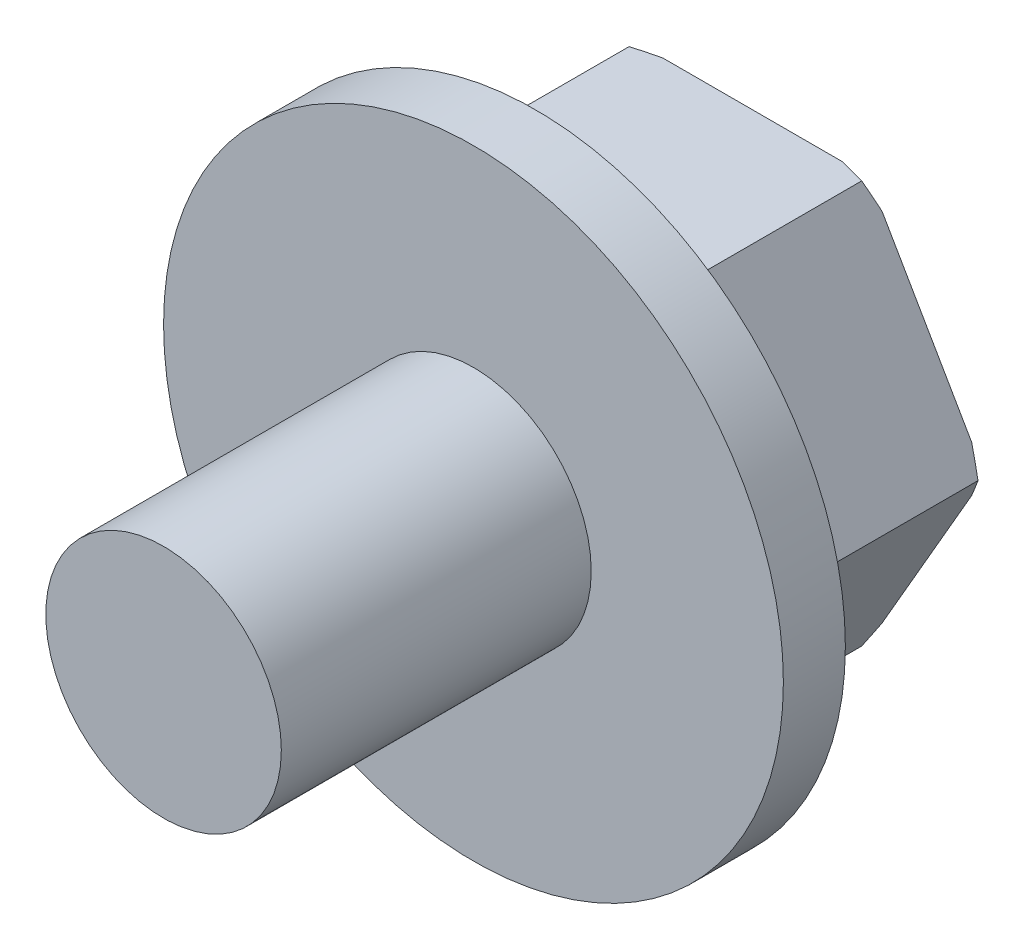
ISO-10303-21;
HEADER;
FILE_DESCRIPTION(('STEP AP214'),'2;1');
FILE_NAME('part.step','',(''),(''),'','','');
FILE_SCHEMA(('AUTOMOTIVE_DESIGN { 1 0 10303 214 1 1 1 1 }'));
ENDSEC;
DATA;
#1=APPLICATION_CONTEXT('core data for automotive mechanical design processes');
#2=APPLICATION_PROTOCOL_DEFINITION('international standard','automotive_design',2000,#1);
#3=PRODUCT_CONTEXT('',#1,'mechanical');
#4=PRODUCT('Part','Part','',(#3));
#5=PRODUCT_RELATED_PRODUCT_CATEGORY('part','',(#4));
#6=PRODUCT_DEFINITION_FORMATION('','',#4);
#7=PRODUCT_DEFINITION_CONTEXT('part definition',#1,'design');
#8=PRODUCT_DEFINITION('design','',#6,#7);
#9=PRODUCT_DEFINITION_SHAPE('','',#8);
#10=(LENGTH_UNIT() NAMED_UNIT(*) SI_UNIT(.MILLI.,.METRE.));
#11=(NAMED_UNIT(*) PLANE_ANGLE_UNIT() SI_UNIT($,.RADIAN.));
#12=(NAMED_UNIT(*) SI_UNIT($,.STERADIAN.) SOLID_ANGLE_UNIT());
#13=UNCERTAINTY_MEASURE_WITH_UNIT(LENGTH_MEASURE(1.E-05),#10,'distance_accuracy_value','');
#14=(GEOMETRIC_REPRESENTATION_CONTEXT(3) GLOBAL_UNCERTAINTY_ASSIGNED_CONTEXT((#13)) GLOBAL_UNIT_ASSIGNED_CONTEXT((#10,
#11,#12)) REPRESENTATION_CONTEXT('',''));
#15=CARTESIAN_POINT('',(0.,0.,0.));
#16=DIRECTION('',(0.,0.,1.));
#17=DIRECTION('',(1.,0.,0.));
#18=AXIS2_PLACEMENT_3D('',#15,#16,#17);
#19=CARTESIAN_POINT('',(3.75277674973256,-6.5,-9.));
#20=DIRECTION('',(0.,1.,0.));
#21=DIRECTION('',(-1.,0.,0.));
#22=AXIS2_PLACEMENT_3D('',#19,#20,#21);
#23=PLANE('',#22);
#24=CARTESIAN_POINT('',(8.28181766104751,-6.50000000000001,-7.02914133790201));
#25=CARTESIAN_POINT('',(8.04691140789701,-6.50000000000001,-7.13580066143891));
#26=CARTESIAN_POINT('',(7.81136438394347,-6.50000000000001,-7.24107552655369));
#27=CARTESIAN_POINT('',(7.33871426189048,-6.50000000000001,-7.44818481369506));
#28=CARTESIAN_POINT('',(7.10161089266545,-6.5,-7.55001861618904));
#29=CARTESIAN_POINT('',(6.62466931895793,-6.5,-7.7499498022196));
#30=CARTESIAN_POINT('',(6.38482384649444,-6.5,-7.84802991425982));
#31=CARTESIAN_POINT('',(5.90311000138813,-6.5,-8.03907689892376));
#32=CARTESIAN_POINT('',(5.66124172188347,-6.5,-8.13204400549372));
#33=CARTESIAN_POINT('',(5.17623717011095,-6.5,-8.31133703523035));
#34=CARTESIAN_POINT('',(4.9331109530856,-6.5,-8.3976900238382));
#35=CARTESIAN_POINT('',(4.4442629999642,-6.5,-8.56280360544821));
#36=CARTESIAN_POINT('',(4.19854113617215,-6.5,-8.6415638229664));
#37=CARTESIAN_POINT('',(3.70462585947118,-6.5,-8.7896928140595));
#38=CARTESIAN_POINT('',(3.4564362569125,-6.5,-8.85907419841018));
#39=CARTESIAN_POINT('',(2.95715882268171,-6.5,-8.98660717477958));
#40=CARTESIAN_POINT('',(2.70607111698214,-6.5,-9.04475925297161));
#41=CARTESIAN_POINT('',(2.27277229646997,-6.5,-9.13310647096523));
#42=CARTESIAN_POINT('',(2.09122383548099,-6.5,-9.16655299626264));
#43=CARTESIAN_POINT('',(1.72690547635735,-6.5,-9.22582503432564));
#44=CARTESIAN_POINT('',(1.54413578494297,-6.5,-9.25165180507598));
#45=CARTESIAN_POINT('',(1.17764186985032,-6.5,-9.2950114888886));
#46=CARTESIAN_POINT('',(0.993917830049214,-6.5,-9.31254594380455));
#47=CARTESIAN_POINT('',(0.625836378114421,-6.5,-9.33882033728644));
#48=CARTESIAN_POINT('',(0.441478967529576,-6.5,-9.34756029734308));
#49=CARTESIAN_POINT('',(0.0726556136066472,-6.5,-9.35597332245495));
#50=CARTESIAN_POINT('',(-0.111810216062938,-6.5,-9.35565131932693));
#51=CARTESIAN_POINT('',(-0.480500177599154,-6.5,-9.34596330712538));
#52=CARTESIAN_POINT('',(-0.664724310670014,-6.5,-9.3365973432852));
#53=CARTESIAN_POINT('',(-1.03251933626419,-6.5,-9.30910724876735));
#54=CARTESIAN_POINT('',(-1.21609021338703,-6.5,-9.29098291297134));
#55=CARTESIAN_POINT('',(-1.58224506221558,-6.5,-9.24650071901516));
#56=CARTESIAN_POINT('',(-1.76482884643231,-6.5,-9.22014134897069));
#57=CARTESIAN_POINT('',(-2.49517184775641,-6.5,-9.0991439352449));
#58=CARTESIAN_POINT('',(-3.03800602540106,-6.5,-8.97389020443029));
#59=CARTESIAN_POINT('',(-3.84218256778286,-6.5,-8.75023239462364));
#60=CARTESIAN_POINT('',(-4.10891805457427,-6.5,-8.6695828194748));
#61=CARTESIAN_POINT('',(-4.63929797297004,-6.5,-8.4986175754123));
#62=CARTESIAN_POINT('',(-4.90294262352719,-6.5,-8.40830259583661));
#63=CARTESIAN_POINT('',(-5.43049205514873,-6.5,-8.21881479537283));
#64=CARTESIAN_POINT('',(-5.6943634887476,-6.5,-8.11955035878753));
#65=CARTESIAN_POINT('',(-6.2196331143329,-6.5,-7.91464925101966));
#66=CARTESIAN_POINT('',(-6.48103114780285,-6.5,-7.80901217458146));
#67=CARTESIAN_POINT('',(-7.00004396308632,-6.5,-7.59330495095508));
#68=CARTESIAN_POINT('',(-7.25767221417062,-6.5,-7.48326703999315));
#69=CARTESIAN_POINT('',(-7.77105663645724,-6.5,-7.25907245154073));
#70=CARTESIAN_POINT('',(-8.02681325836448,-6.5,-7.14491680771469));
#71=CARTESIAN_POINT('',(-8.28181766104751,-6.5,-7.02914133790201));
#72=B_SPLINE_CURVE_WITH_KNOTS('',3,(#24,#25,#26,#27,#28,#29,#30,#31,#32,#33,#34,#35,#36,#37,#38,
#39,#40,#41,#42,#43,#44,#45,#46,#47,#48,#49,#50,#51,#52,#53,#54,#55,#56,#57,#58,#59,#60,#61,#62,
#63,#64,#65,#66,#67,#68,#69,#70,#71),.UNSPECIFIED.,.F.,.F.,(4,2,2,2,2,2,2,2,2,2,2,2,2,2,2,2,2,2,
2,2,2,2,2,4),(0.,0.773972261519475,1.54808313532294,2.32540851640581,3.10269830122373,
3.87661547485808,4.65057090127108,5.42347509030744,6.19634580891712,6.75001639438073,
7.30359552028251,7.85707167447617,8.41054647616225,8.96372006458749,9.51689088632987,
10.0700746637876,10.6233600609622,12.290652469806,13.1265747792743,13.9624375103302,
14.8081222705279,15.6538608672108,16.4942544222457,17.3344384637358),.UNSPECIFIED.);
#73=CARTESIAN_POINT('',(3.75277674973256,-6.5,-8.77414395477849));
#74=VERTEX_POINT('',#73);
#75=CARTESIAN_POINT('',(2.89207693830289,-6.5,-9.));
#76=VERTEX_POINT('',#75);
#77=EDGE_CURVE('E246',#74,#76,#72,.T.);
#78=ORIENTED_EDGE('',*,*,#77,.F.);
#79=DIRECTION('',(0.,0.,1.));
#80=VECTOR('',#79,1.);
#81=CARTESIAN_POINT('',(3.75277674973256,-6.5,-9.));
#82=LINE('',#81,#80);
#83=CARTESIAN_POINT('',(3.75277674973256,-6.5,-2.));
#84=VERTEX_POINT('',#83);
#85=EDGE_CURVE('E164',#74,#84,#82,.T.);
#86=ORIENTED_EDGE('',*,*,#85,.T.);
#87=DIRECTION('',(-1.,0.,0.));
#88=VECTOR('',#87,1.);
#89=CARTESIAN_POINT('',(3.75277674973256,-6.5,-2.));
#90=LINE('',#89,#88);
#91=CARTESIAN_POINT('',(-3.75277674973257,-6.5,-2.));
#92=VERTEX_POINT('',#91);
#93=EDGE_CURVE('E165',#84,#92,#90,.T.);
#94=ORIENTED_EDGE('',*,*,#93,.T.);
#95=DIRECTION('',(0.,0.,1.));
#96=VECTOR('',#95,1.);
#97=CARTESIAN_POINT('',(-3.75277674973257,-6.5,-9.));
#98=LINE('',#97,#96);
#99=CARTESIAN_POINT('',(-3.75277674973247,-6.50000000000017,-8.77414395477862));
#100=VERTEX_POINT('',#99);
#101=EDGE_CURVE('E190',#100,#92,#98,.T.);
#102=ORIENTED_EDGE('',*,*,#101,.F.);
#103=CARTESIAN_POINT('',(-2.8920769383029,-6.5,-9.));
#104=VERTEX_POINT('',#103);
#105=EDGE_CURVE('E238',#104,#100,#72,.T.);
#106=ORIENTED_EDGE('',*,*,#105,.F.);
#107=DIRECTION('',(-1.,0.,0.));
#108=VECTOR('',#107,1.);
#109=CARTESIAN_POINT('',(3.75277674973256,-6.5,-9.));
#110=LINE('',#109,#108);
#111=EDGE_CURVE('E148',#76,#104,#110,.T.);
#112=ORIENTED_EDGE('',*,*,#111,.F.);
#113=EDGE_LOOP('',(#78,#86,#94,#102,#106,#112));
#114=FACE_BOUND('',#113,.T.);
#115=ADVANCED_FACE('F34',(#114),#23,.F.);
#116=CARTESIAN_POINT('',(-3.75277674973257,-6.5,-9.));
#117=DIRECTION('',(0.866025403784438,0.5,0.));
#118=DIRECTION('',(-0.5,0.866025403784439,0.));
#119=AXIS2_PLACEMENT_3D('',#116,#117,#118);
#120=PLANE('',#119);
#121=CARTESIAN_POINT('',(-1.13793376041405,-11.0290409113149,-6.70605461637835));
#122=CARTESIAN_POINT('',(-1.25589780943969,-10.824721184936,-6.81638215702514));
#123=CARTESIAN_POINT('',(-1.37414325918223,-10.6199140582181,-6.92552455235033));
#124=CARTESIAN_POINT('',(-1.61131562440023,-10.2091194715092,-7.14088275188807));
#125=CARTESIAN_POINT('',(-1.73024262284655,-10.0031318678085,-7.24709819022398));
#126=CARTESIAN_POINT('',(-1.96924786629488,-9.58916264288066,-7.45635150098988));
#127=CARTESIAN_POINT('',(-2.0893285729588,-9.38117675792997,-7.5593781620316));
#128=CARTESIAN_POINT('',(-2.33038715653231,-8.96365104358007,-7.76113449493463));
#129=CARTESIAN_POINT('',(-2.45136500499501,-8.7541112634523,-7.85986430236598));
#130=CARTESIAN_POINT('',(-2.69748005604583,-8.32782749052487,-8.05455281144288));
#131=CARTESIAN_POINT('',(-2.82264431496034,-8.11103663479324,-8.15037533590913));
#132=CARTESIAN_POINT('',(-3.07423310053659,-7.67527207556061,-8.33523006799508));
#133=CARTESIAN_POINT('',(-3.2006576882921,-7.45629826624213,-8.42426194461428));
#134=CARTESIAN_POINT('',(-3.45479814739088,-7.01611407882416,-8.59384876365764));
#135=CARTESIAN_POINT('',(-3.58251265317564,-6.7949060659414,-8.67441181282673));
#136=CARTESIAN_POINT('',(-3.83944110035023,-6.34989294152523,-8.82520879634314));
#137=CARTESIAN_POINT('',(-3.96865484666894,-6.12608816786492,-8.89544405856735));
#138=CARTESIAN_POINT('',(-4.27753849391411,-5.5910859972091,-9.04738500187079));
#139=CARTESIAN_POINT('',(-4.45792690450027,-5.27864410497727,-9.12348701178583));
#140=CARTESIAN_POINT('',(-4.73036846575257,-4.8067614787949,-9.21512990599749));
#141=CARTESIAN_POINT('',(-4.82149064678282,-4.64893323155403,-9.24192559788983));
#142=CARTESIAN_POINT('',(-5.00423892971958,-4.33240392051158,-9.28734144150385));
#143=CARTESIAN_POINT('',(-5.09586496232345,-4.17370297674571,-9.30596269044761));
#144=CARTESIAN_POINT('',(-5.27839093782205,-3.85755871348107,-9.33433358048475));
#145=CARTESIAN_POINT('',(-5.36928695417243,-3.70012219495661,-9.34418374695059));
#146=CARTESIAN_POINT('',(-5.55121126899005,-3.38502003856032,-9.35508674173192));
#147=CARTESIAN_POINT('',(-5.6422395660073,-3.22735440319999,-9.35613966576239));
#148=CARTESIAN_POINT('',(-5.82421329045264,-2.91216666681812,-9.34941502148687));
#149=CARTESIAN_POINT('',(-5.91515871871977,-2.75464456434333,-9.34163754360558));
#150=CARTESIAN_POINT('',(-6.09677314868232,-2.44007914426053,-9.31748790120624));
#151=CARTESIAN_POINT('',(-6.18744210629905,-2.28303590299905,-9.30111443158763));
#152=CARTESIAN_POINT('',(-6.40123985937311,-1.91272733213072,-9.25278713694611));
#153=CARTESIAN_POINT('',(-6.52417229998942,-1.69980209908482,-9.21733164970232));
#154=CARTESIAN_POINT('',(-6.76887034621695,-1.2759726505059,-9.13292928698612));
#155=CARTESIAN_POINT('',(-6.89063578123641,-1.06506873044647,-9.08398046928281));
#156=CARTESIAN_POINT('',(-7.13298101570221,-0.645314471379513,-8.97443810530169));
#157=CARTESIAN_POINT('',(-7.25355932018932,-0.436466721717338,-8.91383146528296));
#158=CARTESIAN_POINT('',(-7.49336630984826,-0.0211088316179082,-8.78288403378761));
#159=CARTESIAN_POINT('',(-7.61259507934844,0.185401454880324,-8.71254385420363));
#160=CARTESIAN_POINT('',(-7.85120784718117,0.598690892101246,-8.56291044047199));
#161=CARTESIAN_POINT('',(-7.97057644167009,0.805443362584153,-8.48351963703173));
#162=CARTESIAN_POINT('',(-8.20804860063798,1.2167572072996,-8.31801892116));
#163=CARTESIAN_POINT('',(-8.32615294403785,1.42131993066273,-8.23191345327483));
#164=CARTESIAN_POINT('',(-8.56128385492858,1.82857861475543,-8.0541713955546));
#165=CARTESIAN_POINT('',(-8.6783106400695,2.03127495246596,-7.96253595224728));
#166=CARTESIAN_POINT('',(-8.91144434592434,2.43507437596336,-7.77470009383696));
#167=CARTESIAN_POINT('',(-9.02755124939309,2.63617743188072,-7.67849959338732));
#168=CARTESIAN_POINT('',(-9.22584446233544,2.97963135149295,-7.51039911380142));
#169=CARTESIAN_POINT('',(-9.30822776861516,3.12232342366494,-7.43942482172704));
#170=CARTESIAN_POINT('',(-9.47262267245291,3.40706374961732,-7.29579049864082));
#171=CARTESIAN_POINT('',(-9.55463428278451,3.54911202552219,-7.22313052609169));
#172=CARTESIAN_POINT('',(-9.71743666185269,3.83109401766136,-7.07712502346139));
#173=CARTESIAN_POINT('',(-9.7982310218556,3.97103395415142,-7.00379548641795));
#174=CARTESIAN_POINT('',(-9.95952640583916,4.25040575423728,-6.85584917258802));
#175=CARTESIAN_POINT('',(-10.0400274246483,4.38983760887573,-6.78123237323911));
#176=CARTESIAN_POINT('',(-10.1203964887836,4.52904091131495,-6.70605461637836));
#177=B_SPLINE_CURVE_WITH_KNOTS('',3,(#121,#122,#123,#124,#125,#126,#127,#128,#129,#130,#131,
#132,#133,#134,#135,#136,#137,#138,#139,#140,#141,#142,#143,#144,#145,#146,#147,#148,#149,#150,
#151,#152,#153,#154,#155,#156,#157,#158,#159,#160,#161,#162,#163,#164,#165,#166,#167,#168,#169,
#170,#171,#172,#173,#174,#175,#176),.UNSPECIFIED.,.F.,.F.,(4,2,2,2,2,2,2,2,2,2,2,2,2,2,2,2,2,2,
2,2,2,2,2,2,2,2,2,4),(0.,0.781358476670392,1.56281418599703,2.34676154185768,3.13068414543711,
3.9347285419179,4.73881210538882,5.54211881694601,6.34532215428836,7.45027665348182,
8.00273593510876,8.55512103969295,9.10109059666072,9.64705421341148,10.1930122394593,
10.7390531804626,11.4838279807437,12.2287100399877,12.9744336674474,13.7201104367556,
14.4747621900239,15.2289185990882,15.9829191828207,16.7369338686289,17.2751331082826,
17.8133137099522,18.3456548082797,18.8780052466816),.UNSPECIFIED.);
#178=CARTESIAN_POINT('',(-4.1831266554474,-5.75461209826943,-9.));
#179=VERTEX_POINT('',#178);
#180=EDGE_CURVE('E142',#100,#179,#177,.T.);
#181=ORIENTED_EDGE('',*,*,#180,.F.);
#182=ORIENTED_EDGE('',*,*,#101,.T.);
#183=DIRECTION('',(-0.5,0.866025403784439,0.));
#184=VECTOR('',#183,1.);
#185=CARTESIAN_POINT('',(-3.75277674973257,-6.5,-2.));
#186=LINE('',#185,#184);
#187=CARTESIAN_POINT('',(-7.50555349946513,0.,-2.));
#188=VERTEX_POINT('',#187);
#189=EDGE_CURVE('E168',#92,#188,#186,.T.);
#190=ORIENTED_EDGE('',*,*,#189,.T.);
#191=DIRECTION('',(0.,0.,1.));
#192=VECTOR('',#191,1.);
#193=CARTESIAN_POINT('',(-7.50555349946513,0.,-9.));
#194=LINE('',#193,#192);
#195=CARTESIAN_POINT('',(-7.50555349946523,-1.74071033628086E-13,-8.77414395477862));
#196=VERTEX_POINT('',#195);
#197=EDGE_CURVE('E141',#196,#188,#194,.T.);
#198=ORIENTED_EDGE('',*,*,#197,.F.);
#199=CARTESIAN_POINT('',(-7.0752035937503,-0.74538790173057,-9.));
#200=VERTEX_POINT('',#199);
#201=EDGE_CURVE('E125',#200,#196,#177,.T.);
#202=ORIENTED_EDGE('',*,*,#201,.F.);
#203=DIRECTION('',(-0.5,0.866025403784439,0.));
#204=VECTOR('',#203,1.);
#205=CARTESIAN_POINT('',(-3.75277674973257,-6.5,-9.));
#206=LINE('',#205,#204);
#207=EDGE_CURVE('E139',#179,#200,#206,.T.);
#208=ORIENTED_EDGE('',*,*,#207,.F.);
#209=EDGE_LOOP('',(#181,#182,#190,#198,#202,#208));
#210=FACE_BOUND('',#209,.T.);
#211=ADVANCED_FACE('F138',(#210),#120,.F.);
#212=CARTESIAN_POINT('',(-7.50555349946513,0.,-9.));
#213=DIRECTION('',(0.866025403784438,-0.5,0.));
#214=DIRECTION('',(0.5,0.866025403784438,0.));
#215=AXIS2_PLACEMENT_3D('',#212,#213,#214);
#216=PLANE('',#215);
#217=CARTESIAN_POINT('',(-10.1203964887837,-4.52904091131495,-6.70605461637835));
#218=CARTESIAN_POINT('',(-10.002432439758,-4.32472118493601,-6.81638215702514));
#219=CARTESIAN_POINT('',(-9.88418699001547,-4.11991405821809,-6.92552455235033));
#220=CARTESIAN_POINT('',(-9.64701462479747,-3.70911947150924,-7.14088275188807));
#221=CARTESIAN_POINT('',(-9.52808762635116,-3.50313186780854,-7.24709819022398));
#222=CARTESIAN_POINT('',(-9.28908238290282,-3.08916264288067,-7.45635150098988));
#223=CARTESIAN_POINT('',(-9.1690016762389,-2.88117675792998,-7.55937816203159));
#224=CARTESIAN_POINT('',(-8.92794309266539,-2.46365104358008,-7.76113449493463));
#225=CARTESIAN_POINT('',(-8.80696524420269,-2.2541112634523,-7.85986430236598));
#226=CARTESIAN_POINT('',(-8.56085019315187,-1.82782749052488,-8.05455281144287));
#227=CARTESIAN_POINT('',(-8.43568593423736,-1.61103663479325,-8.15037533590913));
#228=CARTESIAN_POINT('',(-8.18409714866111,-1.17527207556062,-8.33523006799508));
#229=CARTESIAN_POINT('',(-8.0576725609056,-0.956298266242135,-8.42426194461428));
#230=CARTESIAN_POINT('',(-7.80353210180682,-0.516114078824168,-8.59384876365764));
#231=CARTESIAN_POINT('',(-7.67581759602206,-0.294906065941407,-8.67441181282673));
#232=CARTESIAN_POINT('',(-7.41888914884747,0.150107058474761,-8.82520879634314));
#233=CARTESIAN_POINT('',(-7.28967540252876,0.37391183213508,-8.89544405856735));
#234=CARTESIAN_POINT('',(-6.98079175528359,0.908914002790892,-9.04738500187079));
#235=CARTESIAN_POINT('',(-6.80040334469743,1.22135589502272,-9.12348701178583));
#236=CARTESIAN_POINT('',(-6.52796178344513,1.69323852120509,-9.21512990599749));
#237=CARTESIAN_POINT('',(-6.43683960241488,1.85106676844596,-9.24192559788983));
#238=CARTESIAN_POINT('',(-6.25409131947812,2.16759607948842,-9.28734144150385));
#239=CARTESIAN_POINT('',(-6.16246528687425,2.32629702325428,-9.30596269044761));
#240=CARTESIAN_POINT('',(-5.97993931137565,2.64244128651892,-9.33433358048475));
#241=CARTESIAN_POINT('',(-5.88904329502528,2.79987780504338,-9.34418374695059));
#242=CARTESIAN_POINT('',(-5.70711898020765,3.11497996143967,-9.35508674173192));
#243=CARTESIAN_POINT('',(-5.6160906831904,3.27264559680001,-9.35613966576239));
#244=CARTESIAN_POINT('',(-5.43411695874507,3.58783333318187,-9.34941502148687));
#245=CARTESIAN_POINT('',(-5.34317153047793,3.74535543565666,-9.34163754360558));
#246=CARTESIAN_POINT('',(-5.16155710051538,4.05992085573946,-9.31748790120624));
#247=CARTESIAN_POINT('',(-5.07088814289865,4.21696409700094,-9.30111443158764));
#248=CARTESIAN_POINT('',(-4.85709038982459,4.58727266786928,-9.25278713694611));
#249=CARTESIAN_POINT('',(-4.73415794920828,4.80019790091517,-9.21733164970232));
#250=CARTESIAN_POINT('',(-4.48945990298075,5.22402734949409,-9.13292928698613));
#251=CARTESIAN_POINT('',(-4.36769446796129,5.43493126955352,-9.08398046928282));
#252=CARTESIAN_POINT('',(-4.12534923349549,5.85468552862048,-8.9744381053017));
#253=CARTESIAN_POINT('',(-4.00477092900839,6.06353327828265,-8.91383146528296));
#254=CARTESIAN_POINT('',(-3.76496393934945,6.47889116838208,-8.78288403378761));
#255=CARTESIAN_POINT('',(-3.64573516984927,6.68540145488031,-8.71254385420364));
#256=CARTESIAN_POINT('',(-3.40712240201654,7.09869089210124,-8.56291044047199));
#257=CARTESIAN_POINT('',(-3.28775380752761,7.30544336258414,-8.48351963703174));
#258=CARTESIAN_POINT('',(-3.05028164855973,7.71675720729959,-8.31801892116001));
#259=CARTESIAN_POINT('',(-2.93217730515986,7.92131993066272,-8.23191345327484));
#260=CARTESIAN_POINT('',(-2.69704639426913,8.32857861475542,-8.0541713955546));
#261=CARTESIAN_POINT('',(-2.5800196091282,8.53127495246595,-7.96253595224729));
#262=CARTESIAN_POINT('',(-2.34688590327336,8.93507437596334,-7.77470009383696));
#263=CARTESIAN_POINT('',(-2.23077899980462,9.13617743188071,-7.67849959338732));
#264=CARTESIAN_POINT('',(-2.03248578686226,9.47963135149294,-7.51039911380143));
#265=CARTESIAN_POINT('',(-1.95010248058254,9.62232342366493,-7.43942482172704));
#266=CARTESIAN_POINT('',(-1.78570757674479,9.90706374961731,-7.29579049864082));
#267=CARTESIAN_POINT('',(-1.70369596641319,10.0491120255222,-7.2231305260917));
#268=CARTESIAN_POINT('',(-1.54089358734501,10.3310940176614,-7.07712502346139));
#269=CARTESIAN_POINT('',(-1.4600992273421,10.4710339541514,-7.00379548641795));
#270=CARTESIAN_POINT('',(-1.29880384335853,10.7504057542373,-6.85584917258802));
#271=CARTESIAN_POINT('',(-1.21830282454941,10.8898376088757,-6.78123237323911));
#272=CARTESIAN_POINT('',(-1.13793376041404,11.029040911315,-6.70605461637836));
#273=B_SPLINE_CURVE_WITH_KNOTS('',3,(#217,#218,#219,#220,#221,#222,#223,#224,#225,#226,#227,
#228,#229,#230,#231,#232,#233,#234,#235,#236,#237,#238,#239,#240,#241,#242,#243,#244,#245,#246,
#247,#248,#249,#250,#251,#252,#253,#254,#255,#256,#257,#258,#259,#260,#261,#262,#263,#264,#265,
#266,#267,#268,#269,#270,#271,#272),.UNSPECIFIED.,.F.,.F.,(4,2,2,2,2,2,2,2,2,2,2,2,2,2,2,2,2,2,
2,2,2,2,2,2,2,2,2,4),(0.,0.781358476670394,1.56281418599703,2.34676154185768,3.13068414543711,
3.9347285419179,4.73881210538882,5.54211881694601,6.34532215428836,7.45027665348183,
8.00273593510877,8.55512103969295,9.10109059666072,9.64705421341148,10.1930122394593,
10.7390531804626,11.4838279807437,12.2287100399877,12.9744336674474,13.7201104367556,
14.4747621900239,15.2289185990882,15.9829191828207,16.7369338686289,17.2751331082826,
17.8133137099522,18.3456548082798,18.8780052466817),.UNSPECIFIED.);
#274=CARTESIAN_POINT('',(-7.0752035937503,0.745387901730564,-9.));
#275=VERTEX_POINT('',#274);
#276=EDGE_CURVE('E127',#196,#275,#273,.T.);
#277=ORIENTED_EDGE('',*,*,#276,.F.);
#278=ORIENTED_EDGE('',*,*,#197,.T.);
#279=DIRECTION('',(0.5,0.866025403784438,0.));
#280=VECTOR('',#279,1.);
#281=CARTESIAN_POINT('',(-7.50555349946513,0.,-2.));
#282=LINE('',#281,#280);
#283=CARTESIAN_POINT('',(-3.75277674973256,6.5,-2.));
#284=VERTEX_POINT('',#283);
#285=EDGE_CURVE('E171',#188,#284,#282,.T.);
#286=ORIENTED_EDGE('',*,*,#285,.T.);
#287=DIRECTION('',(0.,0.,1.));
#288=VECTOR('',#287,1.);
#289=CARTESIAN_POINT('',(-3.75277674973256,6.5,-9.));
#290=LINE('',#289,#288);
#291=CARTESIAN_POINT('',(-3.75277674973256,6.5,-8.77414395477849));
#292=VERTEX_POINT('',#291);
#293=EDGE_CURVE('E187',#292,#284,#290,.T.);
#294=ORIENTED_EDGE('',*,*,#293,.F.);
#295=CARTESIAN_POINT('',(-4.18312665544739,5.75461209826944,-9.));
#296=VERTEX_POINT('',#295);
#297=EDGE_CURVE('E307',#296,#292,#273,.T.);
#298=ORIENTED_EDGE('',*,*,#297,.F.);
#299=DIRECTION('',(0.5,0.866025403784438,0.));
#300=VECTOR('',#299,1.);
#301=CARTESIAN_POINT('',(-7.50555349946513,0.,-9.));
#302=LINE('',#301,#300);
#303=EDGE_CURVE('E147',#275,#296,#302,.T.);
#304=ORIENTED_EDGE('',*,*,#303,.F.);
#305=EDGE_LOOP('',(#277,#278,#286,#294,#298,#304));
#306=FACE_BOUND('',#305,.T.);
#307=ADVANCED_FACE('F231',(#306),#216,.F.);
#308=CARTESIAN_POINT('',(-3.75277674973256,6.5,-9.));
#309=DIRECTION('',(0.,-1.,0.));
#310=DIRECTION('',(1.,0.,0.));
#311=AXIS2_PLACEMENT_3D('',#308,#309,#310);
#312=PLANE('',#311);
#313=CARTESIAN_POINT('',(-8.2818176610475,6.5,-7.02914133790201));
#314=CARTESIAN_POINT('',(-8.04691140789701,6.5,-7.13580066143891));
#315=CARTESIAN_POINT('',(-7.81136438394346,6.5,-7.24107552655369));
#316=CARTESIAN_POINT('',(-7.33871426189048,6.5,-7.44818481369506));
#317=CARTESIAN_POINT('',(-7.10161089266545,6.5,-7.55001861618904));
#318=CARTESIAN_POINT('',(-6.62466931895792,6.5,-7.7499498022196));
#319=CARTESIAN_POINT('',(-6.38482384649444,6.5,-7.84802991425982));
#320=CARTESIAN_POINT('',(-5.90311000138813,6.5,-8.03907689892376));
#321=CARTESIAN_POINT('',(-5.66124172188347,6.5,-8.13204400549372));
#322=CARTESIAN_POINT('',(-5.17623717011095,6.5,-8.31133703523036));
#323=CARTESIAN_POINT('',(-4.93311095308559,6.5,-8.3976900238382));
#324=CARTESIAN_POINT('',(-4.44426299996419,6.5,-8.56280360544821));
#325=CARTESIAN_POINT('',(-4.19854113617215,6.5,-8.6415638229664));
#326=CARTESIAN_POINT('',(-3.70462585947118,6.5,-8.78969281405951));
#327=CARTESIAN_POINT('',(-3.4564362569125,6.5,-8.85907419841018));
#328=CARTESIAN_POINT('',(-2.95715882268171,6.5,-8.98660717477959));
#329=CARTESIAN_POINT('',(-2.70607111698214,6.5,-9.04475925297161));
#330=CARTESIAN_POINT('',(-2.27277229646996,6.5,-9.13310647096523));
#331=CARTESIAN_POINT('',(-2.09122383548098,6.5,-9.16655299626265));
#332=CARTESIAN_POINT('',(-1.72690547635735,6.5,-9.22582503432564));
#333=CARTESIAN_POINT('',(-1.54413578494297,6.5,-9.25165180507598));
#334=CARTESIAN_POINT('',(-1.17764186985032,6.5,-9.2950114888886));
#335=CARTESIAN_POINT('',(-0.993917830049212,6.5,-9.31254594380455));
#336=CARTESIAN_POINT('',(-0.625836378114419,6.5,-9.33882033728644));
#337=CARTESIAN_POINT('',(-0.441478967529574,6.5,-9.34756029734308));
#338=CARTESIAN_POINT('',(-0.072655613606644,6.5,-9.35597332245495));
#339=CARTESIAN_POINT('',(0.111810216062941,6.5,-9.35565131932693));
#340=CARTESIAN_POINT('',(0.480500177599156,6.5,-9.34596330712538));
#341=CARTESIAN_POINT('',(0.664724310670016,6.5,-9.3365973432852));
#342=CARTESIAN_POINT('',(1.0325193362642,6.5,-9.30910724876735));
#343=CARTESIAN_POINT('',(1.21609021338703,6.5,-9.29098291297134));
#344=CARTESIAN_POINT('',(1.58224506221558,6.5,-9.24650071901517));
#345=CARTESIAN_POINT('',(1.76482884643231,6.5,-9.22014134897069));
#346=CARTESIAN_POINT('',(2.49517184775641,6.5,-9.0991439352449));
#347=CARTESIAN_POINT('',(3.03800602540106,6.5,-8.97389020443029));
#348=CARTESIAN_POINT('',(3.84218256778287,6.5,-8.75023239462364));
#349=CARTESIAN_POINT('',(4.10891805457427,6.5,-8.6695828194748));
#350=CARTESIAN_POINT('',(4.63929797297004,6.5,-8.4986175754123));
#351=CARTESIAN_POINT('',(4.9029426235272,6.5,-8.40830259583661));
#352=CARTESIAN_POINT('',(5.43049205514873,6.5,-8.21881479537283));
#353=CARTESIAN_POINT('',(5.6943634887476,6.5,-8.11955035878753));
#354=CARTESIAN_POINT('',(6.2196331143329,6.5,-7.91464925101966));
#355=CARTESIAN_POINT('',(6.48103114780285,6.5,-7.80901217458146));
#356=CARTESIAN_POINT('',(7.00004396308632,6.5,-7.59330495095509));
#357=CARTESIAN_POINT('',(7.25767221417061,6.5,-7.48326703999315));
#358=CARTESIAN_POINT('',(7.77105663645724,6.5,-7.25907245154073));
#359=CARTESIAN_POINT('',(8.02681325836448,6.5,-7.14491680771469));
#360=CARTESIAN_POINT('',(8.28181766104751,6.5,-7.02914133790201));
#361=B_SPLINE_CURVE_WITH_KNOTS('',3,(#313,#314,#315,#316,#317,#318,#319,#320,#321,#322,#323,
#324,#325,#326,#327,#328,#329,#330,#331,#332,#333,#334,#335,#336,#337,#338,#339,#340,#341,#342,
#343,#344,#345,#346,#347,#348,#349,#350,#351,#352,#353,#354,#355,#356,#357,#358,#359,#360),
.UNSPECIFIED.,.F.,.F.,(4,2,2,2,2,2,2,2,2,2,2,2,2,2,2,2,2,2,2,2,2,2,2,4),(0.,0.773972261519474,
1.54808313532294,2.32540851640581,3.10269830122373,3.87661547485808,4.65057090127108,
5.42347509030744,6.19634580891712,6.75001639438074,7.30359552028251,7.85707167447617,
8.41054647616225,8.96372006458749,9.51689088632987,10.0700746637876,10.6233600609622,
12.290652469806,13.1265747792743,13.9624375103302,14.8081222705279,15.6538608672108,
16.4942544222457,17.3344384637358),.UNSPECIFIED.);
#362=CARTESIAN_POINT('',(-2.89207693830289,6.5,-9.));
#363=VERTEX_POINT('',#362);
#364=EDGE_CURVE('E309',#292,#363,#361,.T.);
#365=ORIENTED_EDGE('',*,*,#364,.F.);
#366=ORIENTED_EDGE('',*,*,#293,.T.);
#367=DIRECTION('',(1.,0.,0.));
#368=VECTOR('',#367,1.);
#369=CARTESIAN_POINT('',(-3.75277674973256,6.5,-2.));
#370=LINE('',#369,#368);
#371=CARTESIAN_POINT('',(3.75277674973257,6.5,-2.));
#372=VERTEX_POINT('',#371);
#373=EDGE_CURVE('E174',#284,#372,#370,.T.);
#374=ORIENTED_EDGE('',*,*,#373,.T.);
#375=DIRECTION('',(0.,0.,1.));
#376=VECTOR('',#375,1.);
#377=CARTESIAN_POINT('',(3.75277674973257,6.5,-9.));
#378=LINE('',#377,#376);
#379=CARTESIAN_POINT('',(3.75277674973247,6.50000000000017,-8.77414395477862));
#380=VERTEX_POINT('',#379);
#381=EDGE_CURVE('E185',#380,#372,#378,.T.);
#382=ORIENTED_EDGE('',*,*,#381,.F.);
#383=CARTESIAN_POINT('',(2.8920769383029,6.5,-9.));
#384=VERTEX_POINT('',#383);
#385=EDGE_CURVE('E282',#384,#380,#361,.T.);
#386=ORIENTED_EDGE('',*,*,#385,.F.);
#387=DIRECTION('',(1.,0.,0.));
#388=VECTOR('',#387,1.);
#389=CARTESIAN_POINT('',(-3.75277674973256,6.5,-9.));
#390=LINE('',#389,#388);
#391=EDGE_CURVE('E150',#363,#384,#390,.T.);
#392=ORIENTED_EDGE('',*,*,#391,.F.);
#393=EDGE_LOOP('',(#365,#366,#374,#382,#386,#392));
#394=FACE_BOUND('',#393,.T.);
#395=ADVANCED_FACE('F293',(#394),#312,.F.);
#396=CARTESIAN_POINT('',(3.75277674973257,6.5,-9.));
#397=DIRECTION('',(-0.866025403784439,-0.5,0.));
#398=DIRECTION('',(0.5,-0.866025403784439,0.));
#399=AXIS2_PLACEMENT_3D('',#396,#397,#398);
#400=PLANE('',#399);
#401=CARTESIAN_POINT('',(1.13793376041405,11.0290409113149,-6.70605461637835));
#402=CARTESIAN_POINT('',(1.25589780943969,10.824721184936,-6.81638215702514));
#403=CARTESIAN_POINT('',(1.37414325918223,10.6199140582181,-6.92552455235033));
#404=CARTESIAN_POINT('',(1.61131562440023,10.2091194715092,-7.14088275188807));
#405=CARTESIAN_POINT('',(1.73024262284655,10.0031318678085,-7.24709819022398));
#406=CARTESIAN_POINT('',(1.96924786629488,9.58916264288066,-7.45635150098988));
#407=CARTESIAN_POINT('',(2.0893285729588,9.38117675792998,-7.5593781620316));
#408=CARTESIAN_POINT('',(2.33038715653231,8.96365104358008,-7.76113449493463));
#409=CARTESIAN_POINT('',(2.45136500499501,8.7541112634523,-7.85986430236598));
#410=CARTESIAN_POINT('',(2.69748005604583,8.32782749052487,-8.05455281144288));
#411=CARTESIAN_POINT('',(2.82264431496034,8.11103663479324,-8.15037533590913));
#412=CARTESIAN_POINT('',(3.0742331005366,7.67527207556062,-8.33523006799508));
#413=CARTESIAN_POINT('',(3.2006576882921,7.45629826624213,-8.42426194461428));
#414=CARTESIAN_POINT('',(3.45479814739088,7.01611407882416,-8.59384876365764));
#415=CARTESIAN_POINT('',(3.58251265317565,6.7949060659414,-8.67441181282673));
#416=CARTESIAN_POINT('',(3.83944110035024,6.34989294152524,-8.82520879634314));
#417=CARTESIAN_POINT('',(3.96865484666894,6.12608816786492,-8.89544405856734));
#418=CARTESIAN_POINT('',(4.27753849391411,5.5910859972091,-9.04738500187079));
#419=CARTESIAN_POINT('',(4.45792690450028,5.27864410497727,-9.12348701178583));
#420=CARTESIAN_POINT('',(4.73036846575257,4.8067614787949,-9.21512990599749));
#421=CARTESIAN_POINT('',(4.82149064678282,4.64893323155403,-9.24192559788983));
#422=CARTESIAN_POINT('',(5.00423892971959,4.33240392051158,-9.28734144150385));
#423=CARTESIAN_POINT('',(5.09586496232346,4.17370297674571,-9.30596269044761));
#424=CARTESIAN_POINT('',(5.27839093782205,3.85755871348107,-9.33433358048475));
#425=CARTESIAN_POINT('',(5.36928695417243,3.70012219495661,-9.34418374695059));
#426=CARTESIAN_POINT('',(5.55121126899005,3.38502003856033,-9.35508674173192));
#427=CARTESIAN_POINT('',(5.6422395660073,3.22735440319999,-9.35613966576239));
#428=CARTESIAN_POINT('',(5.82421329045264,2.91216666681812,-9.34941502148687));
#429=CARTESIAN_POINT('',(5.91515871871978,2.75464456434333,-9.34163754360558));
#430=CARTESIAN_POINT('',(6.09677314868233,2.44007914426053,-9.31748790120624));
#431=CARTESIAN_POINT('',(6.18744210629905,2.28303590299906,-9.30111443158763));
#432=CARTESIAN_POINT('',(6.40123985937311,1.91272733213072,-9.25278713694611));
#433=CARTESIAN_POINT('',(6.52417229998942,1.69980209908482,-9.21733164970232));
#434=CARTESIAN_POINT('',(6.76887034621695,1.2759726505059,-9.13292928698612));
#435=CARTESIAN_POINT('',(6.89063578123641,1.06506873044647,-9.08398046928281));
#436=CARTESIAN_POINT('',(7.13298101570221,0.645314471379516,-8.97443810530169));
#437=CARTESIAN_POINT('',(7.25355932018932,0.436466721717341,-8.91383146528296));
#438=CARTESIAN_POINT('',(7.49336630984826,0.0211088316179116,-8.78288403378761));
#439=CARTESIAN_POINT('',(7.61259507934844,-0.185401454880321,-8.71254385420363));
#440=CARTESIAN_POINT('',(7.85120784718117,-0.598690892101244,-8.56291044047199));
#441=CARTESIAN_POINT('',(7.97057644167009,-0.805443362584151,-8.48351963703173));
#442=CARTESIAN_POINT('',(8.20804860063798,-1.2167572072996,-8.31801892116));
#443=CARTESIAN_POINT('',(8.32615294403785,-1.42131993066273,-8.23191345327483));
#444=CARTESIAN_POINT('',(8.56128385492858,-1.82857861475543,-8.0541713955546));
#445=CARTESIAN_POINT('',(8.6783106400695,-2.03127495246596,-7.96253595224728));
#446=CARTESIAN_POINT('',(8.91144434592434,-2.43507437596336,-7.77470009383696));
#447=CARTESIAN_POINT('',(9.02755124939309,-2.63617743188072,-7.67849959338732));
#448=CARTESIAN_POINT('',(9.22584446233544,-2.97963135149295,-7.51039911380142));
#449=CARTESIAN_POINT('',(9.30822776861516,-3.12232342366494,-7.43942482172704));
#450=CARTESIAN_POINT('',(9.47262267245291,-3.40706374961732,-7.29579049864082));
#451=CARTESIAN_POINT('',(9.55463428278451,-3.54911202552219,-7.22313052609169));
#452=CARTESIAN_POINT('',(9.71743666185269,-3.83109401766137,-7.07712502346139));
#453=CARTESIAN_POINT('',(9.7982310218556,-3.97103395415142,-7.00379548641795));
#454=CARTESIAN_POINT('',(9.95952640583917,-4.25040575423728,-6.85584917258801));
#455=CARTESIAN_POINT('',(10.0400274246483,-4.38983760887574,-6.78123237323911));
#456=CARTESIAN_POINT('',(10.1203964887837,-4.52904091131495,-6.70605461637836));
#457=B_SPLINE_CURVE_WITH_KNOTS('',3,(#401,#402,#403,#404,#405,#406,#407,#408,#409,#410,#411,
#412,#413,#414,#415,#416,#417,#418,#419,#420,#421,#422,#423,#424,#425,#426,#427,#428,#429,#430,
#431,#432,#433,#434,#435,#436,#437,#438,#439,#440,#441,#442,#443,#444,#445,#446,#447,#448,#449,
#450,#451,#452,#453,#454,#455,#456),.UNSPECIFIED.,.F.,.F.,(4,2,2,2,2,2,2,2,2,2,2,2,2,2,2,2,2,2,
2,2,2,2,2,2,2,2,2,4),(0.,0.781358476670394,1.56281418599703,2.34676154185768,3.13068414543711,
3.9347285419179,4.73881210538882,5.54211881694601,6.34532215428836,7.45027665348183,
8.00273593510876,8.55512103969295,9.10109059666072,9.64705421341148,10.1930122394593,
10.7390531804626,11.4838279807437,12.2287100399877,12.9744336674474,13.7201104367556,
14.4747621900239,15.2289185990882,15.9829191828207,16.7369338686289,17.2751331082826,
17.8133137099522,18.3456548082798,18.8780052466816),.UNSPECIFIED.);
#458=CARTESIAN_POINT('',(4.18312665544741,5.75461209826943,-9.));
#459=VERTEX_POINT('',#458);
#460=EDGE_CURVE('E58',#380,#459,#457,.T.);
#461=ORIENTED_EDGE('',*,*,#460,.F.);
#462=ORIENTED_EDGE('',*,*,#381,.T.);
#463=DIRECTION('',(0.5,-0.866025403784439,0.));
#464=VECTOR('',#463,1.);
#465=CARTESIAN_POINT('',(3.75277674973257,6.5,-2.));
#466=LINE('',#465,#464);
#467=CARTESIAN_POINT('',(7.50555349946514,0.,-2.));
#468=VERTEX_POINT('',#467);
#469=EDGE_CURVE('E177',#372,#468,#466,.T.);
#470=ORIENTED_EDGE('',*,*,#469,.T.);
#471=DIRECTION('',(0.,0.,1.));
#472=VECTOR('',#471,1.);
#473=CARTESIAN_POINT('',(7.50555349946514,0.,-9.));
#474=LINE('',#473,#472);
#475=CARTESIAN_POINT('',(7.50555349946524,1.70652226673233E-13,-8.77414395477862));
#476=VERTEX_POINT('',#475);
#477=EDGE_CURVE('E183',#476,#468,#474,.T.);
#478=ORIENTED_EDGE('',*,*,#477,.F.);
#479=CARTESIAN_POINT('',(7.0752035937503,0.745387901730576,-9.));
#480=VERTEX_POINT('',#479);
#481=EDGE_CURVE('E276',#480,#476,#457,.T.);
#482=ORIENTED_EDGE('',*,*,#481,.F.);
#483=DIRECTION('',(0.5,-0.866025403784439,0.));
#484=VECTOR('',#483,1.);
#485=CARTESIAN_POINT('',(3.75277674973257,6.5,-9.));
#486=LINE('',#485,#484);
#487=EDGE_CURVE('E158',#459,#480,#486,.T.);
#488=ORIENTED_EDGE('',*,*,#487,.F.);
#489=EDGE_LOOP('',(#461,#462,#470,#478,#482,#488));
#490=FACE_BOUND('',#489,.T.);
#491=ADVANCED_FACE('F289',(#490),#400,.F.);
#492=CARTESIAN_POINT('',(7.50555349946514,0.,-9.));
#493=DIRECTION('',(-0.866025403784438,0.500000000000001,0.));
#494=DIRECTION('',(-0.500000000000001,-0.866025403784438,0.));
#495=AXIS2_PLACEMENT_3D('',#492,#493,#494);
#496=PLANE('',#495);
#497=CARTESIAN_POINT('',(10.1203964887837,4.52904091131495,-6.70605461637835));
#498=CARTESIAN_POINT('',(10.002432439758,4.324721184936,-6.81638215702514));
#499=CARTESIAN_POINT('',(9.88418699001548,4.11991405821808,-6.92552455235032));
#500=CARTESIAN_POINT('',(9.64701462479748,3.70911947150923,-7.14088275188807));
#501=CARTESIAN_POINT('',(9.52808762635116,3.50313186780854,-7.24709819022398));
#502=CARTESIAN_POINT('',(9.28908238290283,3.08916264288066,-7.45635150098988));
#503=CARTESIAN_POINT('',(9.16900167623891,2.88117675792998,-7.55937816203159));
#504=CARTESIAN_POINT('',(8.9279430926654,2.46365104358007,-7.76113449493463));
#505=CARTESIAN_POINT('',(8.80696524420269,2.2541112634523,-7.85986430236598));
#506=CARTESIAN_POINT('',(8.56085019315187,1.82782749052487,-8.05455281144287));
#507=CARTESIAN_POINT('',(8.43568593423737,1.61103663479324,-8.15037533590913));
#508=CARTESIAN_POINT('',(8.18409714866111,1.17527207556061,-8.33523006799508));
#509=CARTESIAN_POINT('',(8.05767256090561,0.95629826624213,-8.42426194461428));
#510=CARTESIAN_POINT('',(7.80353210180682,0.516114078824163,-8.59384876365764));
#511=CARTESIAN_POINT('',(7.67581759602206,0.294906065941402,-8.67441181282673));
#512=CARTESIAN_POINT('',(7.41888914884747,-0.150107058474767,-8.82520879634313));
#513=CARTESIAN_POINT('',(7.28967540252876,-0.373911832135085,-8.89544405856734));
#514=CARTESIAN_POINT('',(6.98079175528359,-0.908914002790897,-9.04738500187079));
#515=CARTESIAN_POINT('',(6.80040334469743,-1.22135589502273,-9.12348701178583));
#516=CARTESIAN_POINT('',(6.52796178344513,-1.6932385212051,-9.21512990599749));
#517=CARTESIAN_POINT('',(6.43683960241489,-1.85106676844597,-9.24192559788982));
#518=CARTESIAN_POINT('',(6.25409131947812,-2.16759607948842,-9.28734144150385));
#519=CARTESIAN_POINT('',(6.16246528687425,-2.32629702325429,-9.30596269044761));
#520=CARTESIAN_POINT('',(5.97993931137565,-2.64244128651893,-9.33433358048475));
#521=CARTESIAN_POINT('',(5.88904329502528,-2.79987780504339,-9.34418374695059));
#522=CARTESIAN_POINT('',(5.70711898020765,-3.11497996143967,-9.35508674173192));
#523=CARTESIAN_POINT('',(5.61609068319041,-3.27264559680001,-9.35613966576239));
#524=CARTESIAN_POINT('',(5.43411695874507,-3.58783333318188,-9.34941502148687));
#525=CARTESIAN_POINT('',(5.34317153047793,-3.74535543565667,-9.34163754360558));
#526=CARTESIAN_POINT('',(5.16155710051538,-4.05992085573947,-9.31748790120624));
#527=CARTESIAN_POINT('',(5.07088814289865,-4.21696409700095,-9.30111443158763));
#528=CARTESIAN_POINT('',(4.85709038982459,-4.58727266786928,-9.25278713694611));
#529=CARTESIAN_POINT('',(4.73415794920828,-4.80019790091518,-9.21733164970232));
#530=CARTESIAN_POINT('',(4.48945990298075,-5.2240273494941,-9.13292928698612));
#531=CARTESIAN_POINT('',(4.36769446796129,-5.43493126955353,-9.08398046928281));
#532=CARTESIAN_POINT('',(4.12534923349549,-5.85468552862049,-8.97443810530169));
#533=CARTESIAN_POINT('',(4.00477092900839,-6.06353327828266,-8.91383146528296));
#534=CARTESIAN_POINT('',(3.76496393934945,-6.47889116838209,-8.78288403378761));
#535=CARTESIAN_POINT('',(3.64573516984926,-6.68540145488032,-8.71254385420363));
#536=CARTESIAN_POINT('',(3.40712240201654,-7.09869089210124,-8.56291044047199));
#537=CARTESIAN_POINT('',(3.28775380752761,-7.30544336258415,-8.48351963703173));
#538=CARTESIAN_POINT('',(3.05028164855973,-7.7167572072996,-8.31801892116001));
#539=CARTESIAN_POINT('',(2.93217730515986,-7.92131993066273,-8.23191345327483));
#540=CARTESIAN_POINT('',(2.69704639426913,-8.32857861475542,-8.0541713955546));
#541=CARTESIAN_POINT('',(2.5800196091282,-8.53127495246595,-7.96253595224728));
#542=CARTESIAN_POINT('',(2.34688590327336,-8.93507437596335,-7.77470009383696));
#543=CARTESIAN_POINT('',(2.23077899980462,-9.13617743188071,-7.67849959338732));
#544=CARTESIAN_POINT('',(2.03248578686226,-9.47963135149295,-7.51039911380143));
#545=CARTESIAN_POINT('',(1.95010248058254,-9.62232342366494,-7.43942482172704));
#546=CARTESIAN_POINT('',(1.78570757674479,-9.90706374961732,-7.29579049864082));
#547=CARTESIAN_POINT('',(1.70369596641319,-10.0491120255222,-7.2231305260917));
#548=CARTESIAN_POINT('',(1.54089358734501,-10.3310940176614,-7.07712502346139));
#549=CARTESIAN_POINT('',(1.4600992273421,-10.4710339541514,-7.00379548641795));
#550=CARTESIAN_POINT('',(1.29880384335853,-10.7504057542373,-6.85584917258802));
#551=CARTESIAN_POINT('',(1.21830282454941,-10.8898376088757,-6.78123237323911));
#552=CARTESIAN_POINT('',(1.13793376041404,-11.029040911315,-6.70605461637836));
#553=B_SPLINE_CURVE_WITH_KNOTS('',3,(#497,#498,#499,#500,#501,#502,#503,#504,#505,#506,#507,
#508,#509,#510,#511,#512,#513,#514,#515,#516,#517,#518,#519,#520,#521,#522,#523,#524,#525,#526,
#527,#528,#529,#530,#531,#532,#533,#534,#535,#536,#537,#538,#539,#540,#541,#542,#543,#544,#545,
#546,#547,#548,#549,#550,#551,#552),.UNSPECIFIED.,.F.,.F.,(4,2,2,2,2,2,2,2,2,2,2,2,2,2,2,2,2,2,
2,2,2,2,2,2,2,2,2,4),(0.,0.781358476670393,1.56281418599703,2.34676154185768,3.13068414543711,
3.93472854191791,4.73881210538882,5.54211881694601,6.34532215428836,7.45027665348183,
8.00273593510877,8.55512103969295,9.10109059666073,9.64705421341149,10.1930122394593,
10.7390531804626,11.4838279807437,12.2287100399877,12.9744336674474,13.7201104367556,
14.4747621900239,15.2289185990882,15.9829191828207,16.7369338686289,17.2751331082826,
17.8133137099522,18.3456548082798,18.8780052466817),.UNSPECIFIED.);
#554=CARTESIAN_POINT('',(7.0752035937503,-0.745387901730577,-9.));
#555=VERTEX_POINT('',#554);
#556=EDGE_CURVE('E50',#476,#555,#553,.T.);
#557=ORIENTED_EDGE('',*,*,#556,.F.);
#558=ORIENTED_EDGE('',*,*,#477,.T.);
#559=DIRECTION('',(-0.500000000000001,-0.866025403784438,0.));
#560=VECTOR('',#559,1.);
#561=CARTESIAN_POINT('',(7.50555349946514,0.,-2.));
#562=LINE('',#561,#560);
#563=EDGE_CURVE('E152',#468,#84,#562,.T.);
#564=ORIENTED_EDGE('',*,*,#563,.T.);
#565=ORIENTED_EDGE('',*,*,#85,.F.);
#566=CARTESIAN_POINT('',(4.1831266554474,-5.75461209826943,-9.));
#567=VERTEX_POINT('',#566);
#568=EDGE_CURVE('E245',#567,#74,#553,.T.);
#569=ORIENTED_EDGE('',*,*,#568,.F.);
#570=DIRECTION('',(-0.500000000000001,-0.866025403784438,0.));
#571=VECTOR('',#570,1.);
#572=CARTESIAN_POINT('',(7.50555349946514,0.,-9.));
#573=LINE('',#572,#571);
#574=EDGE_CURVE('E161',#555,#567,#573,.T.);
#575=ORIENTED_EDGE('',*,*,#574,.F.);
#576=EDGE_LOOP('',(#557,#558,#564,#565,#569,#575));
#577=FACE_BOUND('',#576,.T.);
#578=ADVANCED_FACE('F292',(#577),#496,.F.);
#579=CARTESIAN_POINT('',(0.,0.,-9.));
#580=DIRECTION('',(0.,0.,-1.));
#581=DIRECTION('',(-1.,0.,0.));
#582=AXIS2_PLACEMENT_3D('',#579,#580,#581);
#583=PLANE('',#582);
#584=CARTESIAN_POINT('',(0.,0.,-9.));
#585=DIRECTION('',(0.,0.,-1.));
#586=DIRECTION('',(-1.,0.,0.));
#587=AXIS2_PLACEMENT_3D('',#584,#585,#586);
#588=CIRCLE('',#587,6.);
#589=CARTESIAN_POINT('',(-6.,0.,-9.));
#590=VERTEX_POINT('',#589);
#591=EDGE_CURVE('E308',#590,#590,#588,.T.);
#592=ORIENTED_EDGE('',*,*,#591,.F.);
#593=EDGE_LOOP('',(#592));
#594=FACE_BOUND('',#593,.T.);
#595=ORIENTED_EDGE('',*,*,#303,.T.);
#596=CARTESIAN_POINT('',(0.,0.,-9.));
#597=DIRECTION('',(0.,0.,-1.));
#598=DIRECTION('',(-1.,0.,0.));
#599=AXIS2_PLACEMENT_3D('',#596,#597,#598);
#600=CIRCLE('',#599,7.11435935394491);
#601=EDGE_CURVE('E11',#296,#363,#600,.T.);
#602=ORIENTED_EDGE('',*,*,#601,.T.);
#603=ORIENTED_EDGE('',*,*,#391,.T.);
#604=EDGE_CURVE('E43',#384,#459,#600,.T.);
#605=ORIENTED_EDGE('',*,*,#604,.T.);
#606=ORIENTED_EDGE('',*,*,#487,.T.);
#607=EDGE_CURVE('E324',#480,#555,#600,.T.);
#608=ORIENTED_EDGE('',*,*,#607,.T.);
#609=ORIENTED_EDGE('',*,*,#574,.T.);
#610=EDGE_CURVE('E325',#567,#76,#600,.T.);
#611=ORIENTED_EDGE('',*,*,#610,.T.);
#612=ORIENTED_EDGE('',*,*,#111,.T.);
#613=EDGE_CURVE('E132',#104,#179,#600,.T.);
#614=ORIENTED_EDGE('',*,*,#613,.T.);
#615=ORIENTED_EDGE('',*,*,#207,.T.);
#616=EDGE_CURVE('E38',#200,#275,#600,.T.);
#617=ORIENTED_EDGE('',*,*,#616,.T.);
#618=EDGE_LOOP('',(#595,#602,#603,#605,#606,#608,#609,#611,#612,#614,#615,#617));
#619=FACE_BOUND('',#618,.T.);
#620=ADVANCED_FACE('F145',(#594,#619),#583,.T.);
#621=CARTESIAN_POINT('',(0.,0.,10.));
#622=DIRECTION('',(0.,0.,-1.));
#623=DIRECTION('',(-1.,0.,0.));
#624=AXIS2_PLACEMENT_3D('',#621,#622,#623);
#625=CYLINDRICAL_SURFACE('',#624,3.8);
#626=CARTESIAN_POINT('',(0.,0.,10.));
#627=DIRECTION('',(0.,0.,1.));
#628=DIRECTION('',(1.,0.,0.));
#629=AXIS2_PLACEMENT_3D('',#626,#627,#628);
#630=CIRCLE('',#629,3.8);
#631=CARTESIAN_POINT('',(3.8,0.,10.));
#632=VERTEX_POINT('',#631);
#633=EDGE_CURVE('E133',#632,#632,#630,.T.);
#634=ORIENTED_EDGE('',*,*,#633,.F.);
#635=EDGE_LOOP('',(#634));
#636=FACE_BOUND('',#635,.T.);
#637=CARTESIAN_POINT('',(0.,0.,0.));
#638=DIRECTION('',(0.,0.,1.));
#639=DIRECTION('',(1.,0.,0.));
#640=AXIS2_PLACEMENT_3D('',#637,#638,#639);
#641=CIRCLE('',#640,3.8);
#642=CARTESIAN_POINT('',(3.8,0.,0.));
#643=VERTEX_POINT('',#642);
#644=EDGE_CURVE('E196',#643,#643,#641,.T.);
#645=ORIENTED_EDGE('',*,*,#644,.T.);
#646=EDGE_LOOP('',(#645));
#647=FACE_BOUND('',#646,.T.);
#648=ADVANCED_FACE('F36',(#636,#647),#625,.T.);
#649=CARTESIAN_POINT('',(0.,0.,10.));
#650=DIRECTION('',(0.,0.,1.));
#651=DIRECTION('',(1.,0.,0.));
#652=AXIS2_PLACEMENT_3D('',#649,#650,#651);
#653=PLANE('',#652);
#654=ORIENTED_EDGE('',*,*,#633,.T.);
#655=EDGE_LOOP('',(#654));
#656=FACE_BOUND('',#655,.T.);
#657=ADVANCED_FACE('F214',(#656),#653,.T.);
#658=CARTESIAN_POINT('',(0.,0.,-2.));
#659=DIRECTION('',(0.,0.,1.));
#660=DIRECTION('',(1.,0.,0.));
#661=AXIS2_PLACEMENT_3D('',#658,#659,#660);
#662=CYLINDRICAL_SURFACE('',#661,10.);
#663=CARTESIAN_POINT('',(0.,0.,-2.));
#664=DIRECTION('',(0.,0.,-1.));
#665=DIRECTION('',(-1.,0.,0.));
#666=AXIS2_PLACEMENT_3D('',#663,#664,#665);
#667=CIRCLE('',#666,10.);
#668=CARTESIAN_POINT('',(-10.,0.,-2.));
#669=VERTEX_POINT('',#668);
#670=EDGE_CURVE('E193',#669,#669,#667,.T.);
#671=ORIENTED_EDGE('',*,*,#670,.F.);
#672=EDGE_LOOP('',(#671));
#673=FACE_BOUND('',#672,.T.);
#674=CARTESIAN_POINT('',(0.,0.,0.));
#675=DIRECTION('',(0.,0.,-1.));
#676=DIRECTION('',(-1.,0.,0.));
#677=AXIS2_PLACEMENT_3D('',#674,#675,#676);
#678=CIRCLE('',#677,10.);
#679=CARTESIAN_POINT('',(-10.,0.,0.));
#680=VERTEX_POINT('',#679);
#681=EDGE_CURVE('E192',#680,#680,#678,.T.);
#682=ORIENTED_EDGE('',*,*,#681,.T.);
#683=EDGE_LOOP('',(#682));
#684=FACE_BOUND('',#683,.T.);
#685=ADVANCED_FACE('F212',(#673,#684),#662,.T.);
#686=CARTESIAN_POINT('',(0.,0.,-2.));
#687=DIRECTION('',(0.,0.,-1.));
#688=DIRECTION('',(-1.,0.,0.));
#689=AXIS2_PLACEMENT_3D('',#686,#687,#688);
#690=PLANE('',#689);
#691=ORIENTED_EDGE('',*,*,#93,.F.);
#692=ORIENTED_EDGE('',*,*,#563,.F.);
#693=ORIENTED_EDGE('',*,*,#469,.F.);
#694=ORIENTED_EDGE('',*,*,#373,.F.);
#695=ORIENTED_EDGE('',*,*,#285,.F.);
#696=ORIENTED_EDGE('',*,*,#189,.F.);
#697=EDGE_LOOP('',(#691,#692,#693,#694,#695,#696));
#698=FACE_BOUND('',#697,.T.);
#699=ORIENTED_EDGE('',*,*,#670,.T.);
#700=EDGE_LOOP('',(#699));
#701=FACE_BOUND('',#700,.T.);
#702=ADVANCED_FACE('F208',(#698,#701),#690,.T.);
#703=CARTESIAN_POINT('',(0.,0.,0.));
#704=DIRECTION('',(0.,0.,-1.));
#705=DIRECTION('',(-1.,0.,0.));
#706=AXIS2_PLACEMENT_3D('',#703,#704,#705);
#707=PLANE('',#706);
#708=ORIENTED_EDGE('',*,*,#644,.F.);
#709=EDGE_LOOP('',(#708));
#710=FACE_BOUND('',#709,.T.);
#711=ORIENTED_EDGE('',*,*,#681,.F.);
#712=EDGE_LOOP('',(#711));
#713=FACE_BOUND('',#712,.T.);
#714=ADVANCED_FACE('F204',(#710,#713),#707,.F.);
#715=CARTESIAN_POINT('',(0.,0.,-8.5));
#716=DIRECTION('',(0.,0.,-1.));
#717=DIRECTION('',(-1.,0.,0.));
#718=AXIS2_PLACEMENT_3D('',#715,#716,#717);
#719=CYLINDRICAL_SURFACE('',#718,6.);
#720=CARTESIAN_POINT('',(0.,0.,-8.5));
#721=DIRECTION('',(0.,0.,-1.));
#722=DIRECTION('',(-1.,0.,0.));
#723=AXIS2_PLACEMENT_3D('',#720,#721,#722);
#724=CIRCLE('',#723,6.);
#725=CARTESIAN_POINT('',(-6.,0.,-8.5));
#726=VERTEX_POINT('',#725);
#727=EDGE_CURVE('E169',#726,#726,#724,.T.);
#728=ORIENTED_EDGE('',*,*,#727,.F.);
#729=EDGE_LOOP('',(#728));
#730=FACE_BOUND('',#729,.T.);
#731=ORIENTED_EDGE('',*,*,#591,.T.);
#732=EDGE_LOOP('',(#731));
#733=FACE_BOUND('',#732,.T.);
#734=ADVANCED_FACE('F207',(#730,#733),#719,.F.);
#735=CARTESIAN_POINT('',(0.,0.,-8.5));
#736=DIRECTION('',(0.,0.,-1.));
#737=DIRECTION('',(-1.,0.,0.));
#738=AXIS2_PLACEMENT_3D('',#735,#736,#737);
#739=PLANE('',#738);
#740=ORIENTED_EDGE('',*,*,#727,.T.);
#741=EDGE_LOOP('',(#740));
#742=FACE_BOUND('',#741,.T.);
#743=ADVANCED_FACE('F264',(#742),#739,.T.);
#744=CARTESIAN_POINT('',(0.,0.,-8.2));
#745=DIRECTION('',(0.,0.,1.));
#746=DIRECTION('',(1.,0.,0.));
#747=AXIS2_PLACEMENT_3D('',#744,#745,#746);
#748=CONICAL_SURFACE('',#747,8.5,1.04719755119659);
#749=ORIENTED_EDGE('',*,*,#201,.T.);
#750=ORIENTED_EDGE('',*,*,#276,.T.);
#751=ORIENTED_EDGE('',*,*,#616,.F.);
#752=EDGE_LOOP('',(#749,#750,#751));
#753=FACE_BOUND('',#752,.T.);
#754=ADVANCED_FACE('F124',(#753),#748,.T.);
#755=ORIENTED_EDGE('',*,*,#105,.T.);
#756=ORIENTED_EDGE('',*,*,#180,.T.);
#757=ORIENTED_EDGE('',*,*,#613,.F.);
#758=EDGE_LOOP('',(#755,#756,#757));
#759=FACE_BOUND('',#758,.T.);
#760=ADVANCED_FACE('F335',(#759),#748,.T.);
#761=ORIENTED_EDGE('',*,*,#77,.T.);
#762=ORIENTED_EDGE('',*,*,#610,.F.);
#763=ORIENTED_EDGE('',*,*,#568,.T.);
#764=EDGE_LOOP('',(#761,#762,#763));
#765=FACE_BOUND('',#764,.T.);
#766=ADVANCED_FACE('F339',(#765),#748,.T.);
#767=ORIENTED_EDGE('',*,*,#481,.T.);
#768=ORIENTED_EDGE('',*,*,#556,.T.);
#769=ORIENTED_EDGE('',*,*,#607,.F.);
#770=EDGE_LOOP('',(#767,#768,#769));
#771=FACE_BOUND('',#770,.T.);
#772=ADVANCED_FACE('F338',(#771),#748,.T.);
#773=ORIENTED_EDGE('',*,*,#385,.T.);
#774=ORIENTED_EDGE('',*,*,#460,.T.);
#775=ORIENTED_EDGE('',*,*,#604,.F.);
#776=EDGE_LOOP('',(#773,#774,#775));
#777=FACE_BOUND('',#776,.T.);
#778=ADVANCED_FACE('F262',(#777),#748,.T.);
#779=ORIENTED_EDGE('',*,*,#297,.T.);
#780=ORIENTED_EDGE('',*,*,#364,.T.);
#781=ORIENTED_EDGE('',*,*,#601,.F.);
#782=EDGE_LOOP('',(#779,#780,#781));
#783=FACE_BOUND('',#782,.T.);
#784=ADVANCED_FACE('F258',(#783),#748,.T.);
#785=CLOSED_SHELL('',(#115,#211,#307,#395,#491,#578,#620,#648,#657,#685,#702,#714,#734,#743,
#754,#760,#766,#772,#778,#784));
#786=MANIFOLD_SOLID_BREP('B2',#785);
#787=ADVANCED_BREP_SHAPE_REPRESENTATION('',(#18,#786),#14);
#788=SHAPE_DEFINITION_REPRESENTATION(#9,#787);
ENDSEC;
END-ISO-10303-21;
